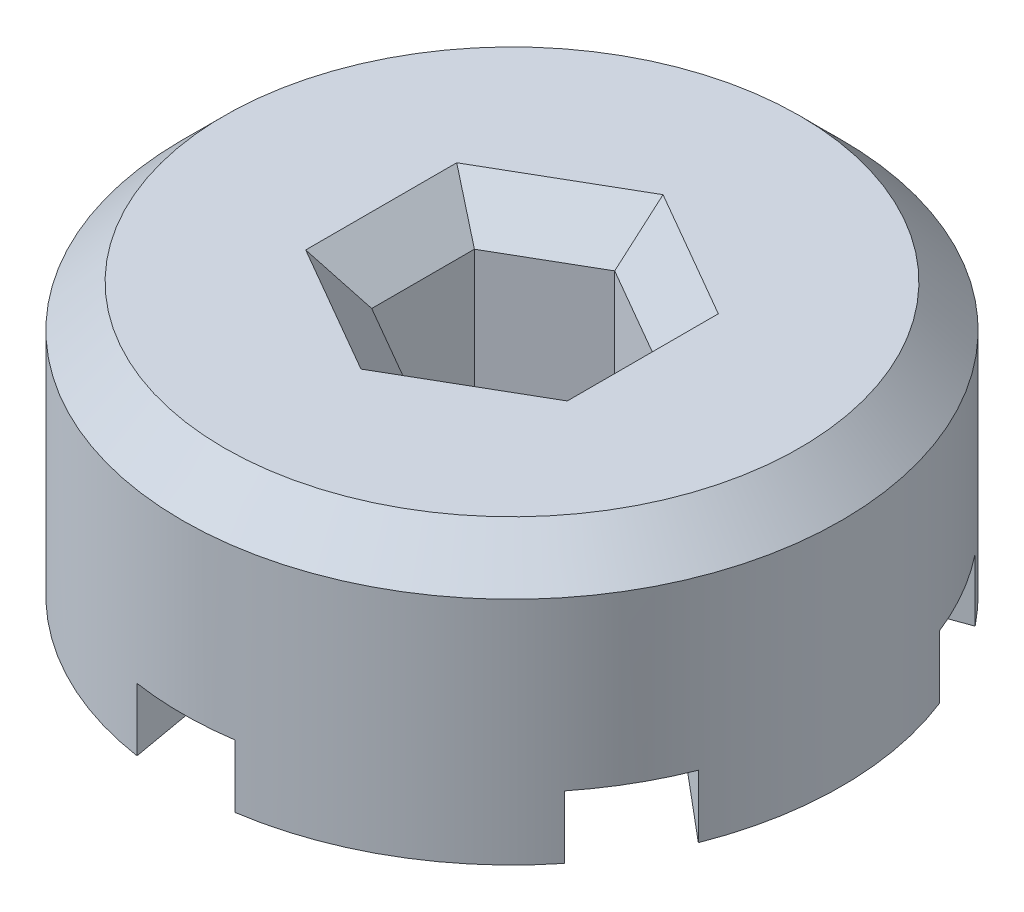
ISO-10303-21;
HEADER;
FILE_DESCRIPTION(('STEP AP214'),'2;1');
FILE_NAME('part.step','',(''),(''),'','','');
FILE_SCHEMA(('AUTOMOTIVE_DESIGN { 1 0 10303 214 1 1 1 1 }'));
ENDSEC;
DATA;
#1=APPLICATION_CONTEXT('core data for automotive mechanical design processes');
#2=APPLICATION_PROTOCOL_DEFINITION('international standard','automotive_design',2000,#1);
#3=PRODUCT_CONTEXT('',#1,'mechanical');
#4=PRODUCT('Part','Part','',(#3));
#5=PRODUCT_RELATED_PRODUCT_CATEGORY('part','',(#4));
#6=PRODUCT_DEFINITION_FORMATION('','',#4);
#7=PRODUCT_DEFINITION_CONTEXT('part definition',#1,'design');
#8=PRODUCT_DEFINITION('design','',#6,#7);
#9=PRODUCT_DEFINITION_SHAPE('','',#8);
#10=(LENGTH_UNIT() NAMED_UNIT(*) SI_UNIT(.MILLI.,.METRE.));
#11=(NAMED_UNIT(*) PLANE_ANGLE_UNIT() SI_UNIT($,.RADIAN.));
#12=(NAMED_UNIT(*) SI_UNIT($,.STERADIAN.) SOLID_ANGLE_UNIT());
#13=UNCERTAINTY_MEASURE_WITH_UNIT(LENGTH_MEASURE(1.E-05),#10,'distance_accuracy_value','');
#14=(GEOMETRIC_REPRESENTATION_CONTEXT(3) GLOBAL_UNCERTAINTY_ASSIGNED_CONTEXT((#13)) GLOBAL_UNIT_ASSIGNED_CONTEXT((#10,
#11,#12)) REPRESENTATION_CONTEXT('',''));
#15=CARTESIAN_POINT('',(0.,0.,0.));
#16=DIRECTION('',(0.,0.,1.));
#17=DIRECTION('',(1.,0.,0.));
#18=AXIS2_PLACEMENT_3D('',#15,#16,#17);
#19=CARTESIAN_POINT('',(0.,10.,0.));
#20=DIRECTION('',(0.,-1.,0.));
#21=DIRECTION('',(0.,0.,-1.));
#22=AXIS2_PLACEMENT_3D('',#19,#20,#21);
#23=CYLINDRICAL_SURFACE('',#22,15.75);
#24=CARTESIAN_POINT('',(0.,7.99999999999999,0.));
#25=DIRECTION('',(0.,1.,0.));
#26=DIRECTION('',(0.,0.,1.));
#27=AXIS2_PLACEMENT_3D('',#24,#25,#26);
#28=CIRCLE('',#27,15.75);
#29=CARTESIAN_POINT('',(0.,7.99999999999999,15.75));
#30=VERTEX_POINT('',#29);
#31=EDGE_CURVE('E400',#30,#30,#28,.F.);
#32=ORIENTED_EDGE('',*,*,#31,.T.);
#33=EDGE_LOOP('',(#32));
#34=FACE_BOUND('',#33,.T.);
#35=CARTESIAN_POINT('',(0.,0.,0.));
#36=DIRECTION('',(0.,1.,0.));
#37=DIRECTION('',(0.,0.,1.));
#38=AXIS2_PLACEMENT_3D('',#35,#36,#37);
#39=CIRCLE('',#38,15.75);
#40=CARTESIAN_POINT('',(-14.6603281465322,0.,5.75649881751027));
#41=VERTEX_POINT('',#40);
#42=CARTESIAN_POINT('',(-12.3154382860851,0.,9.81796719395774));
#43=VERTEX_POINT('',#42);
#44=EDGE_CURVE('E380',#41,#43,#39,.T.);
#45=ORIENTED_EDGE('',*,*,#44,.T.);
#46=DIRECTION('',(0.,1.,0.));
#47=VECTOR('',#46,1.);
#48=CARTESIAN_POINT('',(-12.3154382860851,-3.,9.81796719395774));
#49=LINE('',#48,#47);
#50=CARTESIAN_POINT('',(-12.3154382860851,-3.,9.81796719395774));
#51=VERTEX_POINT('',#50);
#52=EDGE_CURVE('E241',#51,#43,#49,.T.);
#53=ORIENTED_EDGE('',*,*,#52,.F.);
#54=CARTESIAN_POINT('',(0.,-3.,0.));
#55=DIRECTION('',(0.,-1.,0.));
#56=DIRECTION('',(0.,0.,-1.));
#57=AXIS2_PLACEMENT_3D('',#54,#55,#56);
#58=CIRCLE('',#57,15.75);
#59=CARTESIAN_POINT('',(-2.34488986044711,-3.,15.574466011468));
#60=VERTEX_POINT('',#59);
#61=EDGE_CURVE('E232',#60,#51,#58,.T.);
#62=ORIENTED_EDGE('',*,*,#61,.F.);
#63=DIRECTION('',(0.,1.,0.));
#64=VECTOR('',#63,1.);
#65=CARTESIAN_POINT('',(-2.34488986044711,-3.,15.574466011468));
#66=LINE('',#65,#64);
#67=CARTESIAN_POINT('',(-2.34488986044711,0.,15.574466011468));
#68=VERTEX_POINT('',#67);
#69=EDGE_CURVE('E225',#60,#68,#66,.T.);
#70=ORIENTED_EDGE('',*,*,#69,.T.);
#71=CARTESIAN_POINT('',(2.3448898604471,0.,15.574466011468));
#72=VERTEX_POINT('',#71);
#73=EDGE_CURVE('E384',#68,#72,#39,.T.);
#74=ORIENTED_EDGE('',*,*,#73,.T.);
#75=DIRECTION('',(0.,1.,0.));
#76=VECTOR('',#75,1.);
#77=CARTESIAN_POINT('',(2.3448898604471,-3.,15.574466011468));
#78=LINE('',#77,#76);
#79=CARTESIAN_POINT('',(2.3448898604471,-3.,15.574466011468));
#80=VERTEX_POINT('',#79);
#81=EDGE_CURVE('E253',#80,#72,#78,.T.);
#82=ORIENTED_EDGE('',*,*,#81,.F.);
#83=CARTESIAN_POINT('',(0.,-3.,0.));
#84=DIRECTION('',(0.,-1.,0.));
#85=DIRECTION('',(0.,0.,-1.));
#86=AXIS2_PLACEMENT_3D('',#83,#84,#85);
#87=CIRCLE('',#86,15.75);
#88=CARTESIAN_POINT('',(12.315438286085,-3.,9.81796719395775));
#89=VERTEX_POINT('',#88);
#90=EDGE_CURVE('E251',#89,#80,#87,.T.);
#91=ORIENTED_EDGE('',*,*,#90,.F.);
#92=DIRECTION('',(0.,1.,0.));
#93=VECTOR('',#92,1.);
#94=CARTESIAN_POINT('',(12.315438286085,-3.,9.81796719395775));
#95=LINE('',#94,#93);
#96=CARTESIAN_POINT('',(12.315438286085,0.,9.81796719395775));
#97=VERTEX_POINT('',#96);
#98=EDGE_CURVE('E260',#89,#97,#95,.T.);
#99=ORIENTED_EDGE('',*,*,#98,.T.);
#100=CARTESIAN_POINT('',(14.6603281465322,0.,5.75649881751027));
#101=VERTEX_POINT('',#100);
#102=EDGE_CURVE('E830',#97,#101,#39,.T.);
#103=ORIENTED_EDGE('',*,*,#102,.T.);
#104=DIRECTION('',(0.,1.,0.));
#105=VECTOR('',#104,1.);
#106=CARTESIAN_POINT('',(14.6603281465322,-3.,5.75649881751027));
#107=LINE('',#106,#105);
#108=CARTESIAN_POINT('',(14.6603281465322,-3.,5.75649881751027));
#109=VERTEX_POINT('',#108);
#110=EDGE_CURVE('E273',#109,#101,#107,.T.);
#111=ORIENTED_EDGE('',*,*,#110,.F.);
#112=CARTESIAN_POINT('',(0.,-3.,0.));
#113=DIRECTION('',(0.,-1.,0.));
#114=DIRECTION('',(0.,0.,-1.));
#115=AXIS2_PLACEMENT_3D('',#112,#113,#114);
#116=CIRCLE('',#115,15.75);
#117=CARTESIAN_POINT('',(14.6603281465322,-3.,-5.75649881751026));
#118=VERTEX_POINT('',#117);
#119=EDGE_CURVE('E271',#118,#109,#116,.T.);
#120=ORIENTED_EDGE('',*,*,#119,.F.);
#121=DIRECTION('',(0.,1.,0.));
#122=VECTOR('',#121,1.);
#123=CARTESIAN_POINT('',(14.6603281465322,-3.,-5.75649881751026));
#124=LINE('',#123,#122);
#125=CARTESIAN_POINT('',(14.6603281465322,0.,-5.75649881751026));
#126=VERTEX_POINT('',#125);
#127=EDGE_CURVE('E280',#118,#126,#124,.T.);
#128=ORIENTED_EDGE('',*,*,#127,.T.);
#129=CARTESIAN_POINT('',(12.3154382860851,0.,-9.81796719395774));
#130=VERTEX_POINT('',#129);
#131=EDGE_CURVE('E827',#126,#130,#39,.T.);
#132=ORIENTED_EDGE('',*,*,#131,.T.);
#133=DIRECTION('',(0.,1.,0.));
#134=VECTOR('',#133,1.);
#135=CARTESIAN_POINT('',(12.3154382860851,-3.,-9.81796719395774));
#136=LINE('',#135,#134);
#137=CARTESIAN_POINT('',(12.3154382860851,-3.,-9.81796719395774));
#138=VERTEX_POINT('',#137);
#139=EDGE_CURVE('E293',#138,#130,#136,.T.);
#140=ORIENTED_EDGE('',*,*,#139,.F.);
#141=CARTESIAN_POINT('',(0.,-3.,0.));
#142=DIRECTION('',(0.,-1.,0.));
#143=DIRECTION('',(0.,0.,-1.));
#144=AXIS2_PLACEMENT_3D('',#141,#142,#143);
#145=CIRCLE('',#144,15.75);
#146=CARTESIAN_POINT('',(2.34488986044712,-3.,-15.574466011468));
#147=VERTEX_POINT('',#146);
#148=EDGE_CURVE('E291',#147,#138,#145,.T.);
#149=ORIENTED_EDGE('',*,*,#148,.F.);
#150=DIRECTION('',(0.,1.,0.));
#151=VECTOR('',#150,1.);
#152=CARTESIAN_POINT('',(2.34488986044712,-3.,-15.574466011468));
#153=LINE('',#152,#151);
#154=CARTESIAN_POINT('',(2.34488986044712,0.,-15.574466011468));
#155=VERTEX_POINT('',#154);
#156=EDGE_CURVE('E300',#147,#155,#153,.T.);
#157=ORIENTED_EDGE('',*,*,#156,.T.);
#158=CARTESIAN_POINT('',(-2.34488986044709,0.,-15.574466011468));
#159=VERTEX_POINT('',#158);
#160=EDGE_CURVE('E826',#155,#159,#39,.T.);
#161=ORIENTED_EDGE('',*,*,#160,.T.);
#162=DIRECTION('',(0.,1.,0.));
#163=VECTOR('',#162,1.);
#164=CARTESIAN_POINT('',(-2.34488986044709,-3.,-15.574466011468));
#165=LINE('',#164,#163);
#166=CARTESIAN_POINT('',(-2.34488986044709,-3.,-15.574466011468));
#167=VERTEX_POINT('',#166);
#168=EDGE_CURVE('E313',#167,#159,#165,.T.);
#169=ORIENTED_EDGE('',*,*,#168,.F.);
#170=CARTESIAN_POINT('',(0.,-3.,0.));
#171=DIRECTION('',(0.,-1.,0.));
#172=DIRECTION('',(0.,0.,-1.));
#173=AXIS2_PLACEMENT_3D('',#170,#171,#172);
#174=CIRCLE('',#173,15.75);
#175=CARTESIAN_POINT('',(-12.315438286085,-3.,-9.81796719395776));
#176=VERTEX_POINT('',#175);
#177=EDGE_CURVE('E311',#176,#167,#174,.T.);
#178=ORIENTED_EDGE('',*,*,#177,.F.);
#179=DIRECTION('',(0.,1.,0.));
#180=VECTOR('',#179,1.);
#181=CARTESIAN_POINT('',(-12.315438286085,-3.,-9.81796719395776));
#182=LINE('',#181,#180);
#183=CARTESIAN_POINT('',(-12.315438286085,0.,-9.81796719395776));
#184=VERTEX_POINT('',#183);
#185=EDGE_CURVE('E320',#176,#184,#182,.T.);
#186=ORIENTED_EDGE('',*,*,#185,.T.);
#187=CARTESIAN_POINT('',(-14.6603281465322,0.,-5.75649881751027));
#188=VERTEX_POINT('',#187);
#189=EDGE_CURVE('E367',#184,#188,#39,.T.);
#190=ORIENTED_EDGE('',*,*,#189,.T.);
#191=DIRECTION('',(0.,1.,0.));
#192=VECTOR('',#191,1.);
#193=CARTESIAN_POINT('',(-14.6603281465322,-3.,-5.75649881751027));
#194=LINE('',#193,#192);
#195=CARTESIAN_POINT('',(-14.6603281465322,-3.,-5.75649881751027));
#196=VERTEX_POINT('',#195);
#197=EDGE_CURVE('E333',#196,#188,#194,.T.);
#198=ORIENTED_EDGE('',*,*,#197,.F.);
#199=CARTESIAN_POINT('',(0.,-3.,0.));
#200=DIRECTION('',(0.,-1.,0.));
#201=DIRECTION('',(0.,0.,-1.));
#202=AXIS2_PLACEMENT_3D('',#199,#200,#201);
#203=CIRCLE('',#202,15.75);
#204=CARTESIAN_POINT('',(-14.6603281465322,-3.,5.75649881751027));
#205=VERTEX_POINT('',#204);
#206=EDGE_CURVE('E331',#205,#196,#203,.T.);
#207=ORIENTED_EDGE('',*,*,#206,.F.);
#208=DIRECTION('',(0.,1.,0.));
#209=VECTOR('',#208,1.);
#210=CARTESIAN_POINT('',(-14.6603281465322,-3.,5.75649881751027));
#211=LINE('',#210,#209);
#212=EDGE_CURVE('E340',#205,#41,#211,.T.);
#213=ORIENTED_EDGE('',*,*,#212,.T.);
#214=EDGE_LOOP('',(#45,#53,#62,#70,#74,#82,#91,#99,#103,#111,#120,#128,#132,#140,#149,#157,#161,
#169,#178,#186,#190,#198,#207,#213));
#215=FACE_BOUND('',#214,.T.);
#216=ADVANCED_FACE('F34',(#34,#215),#23,.T.);
#217=CARTESIAN_POINT('',(0.,10.,0.));
#218=DIRECTION('',(0.,1.,0.));
#219=DIRECTION('',(0.,0.,1.));
#220=AXIS2_PLACEMENT_3D('',#217,#218,#219);
#221=PLANE('',#220);
#222=CARTESIAN_POINT('',(0.,10.,0.));
#223=DIRECTION('',(0.,1.,0.));
#224=DIRECTION('',(0.,0.,1.));
#225=AXIS2_PLACEMENT_3D('',#222,#223,#224);
#226=CIRCLE('',#225,13.75);
#227=CARTESIAN_POINT('',(0.,10.,13.75));
#228=VERTEX_POINT('',#227);
#229=EDGE_CURVE('E397',#228,#228,#226,.T.);
#230=ORIENTED_EDGE('',*,*,#229,.T.);
#231=EDGE_LOOP('',(#230));
#232=FACE_BOUND('',#231,.T.);
#233=DIRECTION('',(0.866025403784439,0.,-0.5));
#234=VECTOR('',#233,1.);
#235=CARTESIAN_POINT('',(-1.,10.,-6.6395280956807));
#236=LINE('',#235,#234);
#237=CARTESIAN_POINT('',(-6.25,10.,-3.60843918243516));
#238=VERTEX_POINT('',#237);
#239=CARTESIAN_POINT('',(0.,10.,-7.21687836487032));
#240=VERTEX_POINT('',#239);
#241=EDGE_CURVE('E392',#238,#240,#236,.T.);
#242=ORIENTED_EDGE('',*,*,#241,.T.);
#243=DIRECTION('',(0.866025403784439,0.,0.5));
#244=VECTOR('',#243,1.);
#245=CARTESIAN_POINT('',(5.25,10.,-4.18578945162479));
#246=LINE('',#245,#244);
#247=CARTESIAN_POINT('',(6.25,10.,-3.60843918243516));
#248=VERTEX_POINT('',#247);
#249=EDGE_CURVE('E394',#240,#248,#246,.T.);
#250=ORIENTED_EDGE('',*,*,#249,.T.);
#251=DIRECTION('',(0.,0.,1.));
#252=VECTOR('',#251,1.);
#253=CARTESIAN_POINT('',(6.25,10.,2.45373864405591));
#254=LINE('',#253,#252);
#255=CARTESIAN_POINT('',(6.25,10.,3.60843918243516));
#256=VERTEX_POINT('',#255);
#257=EDGE_CURVE('E383',#248,#256,#254,.T.);
#258=ORIENTED_EDGE('',*,*,#257,.T.);
#259=DIRECTION('',(-0.866025403784439,0.,0.5));
#260=VECTOR('',#259,1.);
#261=CARTESIAN_POINT('',(1.,10.,6.6395280956807));
#262=LINE('',#261,#260);
#263=CARTESIAN_POINT('',(0.,10.,7.21687836487033));
#264=VERTEX_POINT('',#263);
#265=EDGE_CURVE('E386',#256,#264,#262,.T.);
#266=ORIENTED_EDGE('',*,*,#265,.T.);
#267=DIRECTION('',(-0.866025403784439,0.,-0.5));
#268=VECTOR('',#267,1.);
#269=CARTESIAN_POINT('',(-5.25,10.,4.18578945162479));
#270=LINE('',#269,#268);
#271=CARTESIAN_POINT('',(-6.25,10.,3.60843918243516));
#272=VERTEX_POINT('',#271);
#273=EDGE_CURVE('E388',#264,#272,#270,.T.);
#274=ORIENTED_EDGE('',*,*,#273,.T.);
#275=DIRECTION('',(0.,0.,-1.));
#276=VECTOR('',#275,1.);
#277=CARTESIAN_POINT('',(-6.25,10.,-2.45373864405591));
#278=LINE('',#277,#276);
#279=EDGE_CURVE('E390',#272,#238,#278,.T.);
#280=ORIENTED_EDGE('',*,*,#279,.T.);
#281=EDGE_LOOP('',(#242,#250,#258,#266,#274,#280));
#282=FACE_BOUND('',#281,.T.);
#283=ADVANCED_FACE('F436',(#232,#282),#221,.T.);
#284=CARTESIAN_POINT('',(0.,0.,0.));
#285=DIRECTION('',(0.,1.,0.));
#286=DIRECTION('',(0.,0.,1.));
#287=AXIS2_PLACEMENT_3D('',#284,#285,#286);
#288=PLANE('',#287);
#289=DIRECTION('',(0.866025403784439,0.,-0.5));
#290=VECTOR('',#289,1.);
#291=CARTESIAN_POINT('',(0.,0.,4.90747728811182));
#292=LINE('',#291,#290);
#293=CARTESIAN_POINT('',(0.,0.,4.90747728811182));
#294=VERTEX_POINT('',#293);
#295=CARTESIAN_POINT('',(4.25,0.,2.45373864405591));
#296=VERTEX_POINT('',#295);
#297=EDGE_CURVE('E361',#294,#296,#292,.T.);
#298=ORIENTED_EDGE('',*,*,#297,.T.);
#299=DIRECTION('',(0.,0.,-1.));
#300=VECTOR('',#299,1.);
#301=CARTESIAN_POINT('',(4.25,0.,2.45373864405591));
#302=LINE('',#301,#300);
#303=CARTESIAN_POINT('',(4.25,0.,-2.45373864405591));
#304=VERTEX_POINT('',#303);
#305=EDGE_CURVE('E346',#296,#304,#302,.T.);
#306=ORIENTED_EDGE('',*,*,#305,.T.);
#307=DIRECTION('',(-0.866025403784439,0.,-0.5));
#308=VECTOR('',#307,1.);
#309=CARTESIAN_POINT('',(4.25,0.,-2.45373864405591));
#310=LINE('',#309,#308);
#311=CARTESIAN_POINT('',(0.,0.,-4.90747728811182));
#312=VERTEX_POINT('',#311);
#313=EDGE_CURVE('E349',#304,#312,#310,.T.);
#314=ORIENTED_EDGE('',*,*,#313,.T.);
#315=DIRECTION('',(-0.866025403784439,0.,0.5));
#316=VECTOR('',#315,1.);
#317=CARTESIAN_POINT('',(0.,0.,-4.90747728811182));
#318=LINE('',#317,#316);
#319=CARTESIAN_POINT('',(-4.25,0.,-2.45373864405591));
#320=VERTEX_POINT('',#319);
#321=EDGE_CURVE('E352',#312,#320,#318,.T.);
#322=ORIENTED_EDGE('',*,*,#321,.T.);
#323=DIRECTION('',(0.,0.,1.));
#324=VECTOR('',#323,1.);
#325=CARTESIAN_POINT('',(-4.25,0.,-2.45373864405591));
#326=LINE('',#325,#324);
#327=CARTESIAN_POINT('',(-4.25,0.,2.45373864405591));
#328=VERTEX_POINT('',#327);
#329=EDGE_CURVE('E355',#320,#328,#326,.T.);
#330=ORIENTED_EDGE('',*,*,#329,.T.);
#331=DIRECTION('',(0.866025403784439,0.,0.5));
#332=VECTOR('',#331,1.);
#333=CARTESIAN_POINT('',(-4.25,0.,2.45373864405591));
#334=LINE('',#333,#332);
#335=EDGE_CURVE('E358',#328,#294,#334,.T.);
#336=ORIENTED_EDGE('',*,*,#335,.T.);
#337=EDGE_LOOP('',(#298,#306,#314,#322,#330,#336));
#338=FACE_BOUND('',#337,.T.);
#339=DIRECTION('',(0.173648177666932,0.,0.984807753012208));
#340=VECTOR('',#339,1.);
#341=CARTESIAN_POINT('',(-4.93757332816402,0.,0.870627396981817));
#342=LINE('',#341,#340);
#343=CARTESIAN_POINT('',(-3.9,0.,6.75499814951862));
#344=VERTEX_POINT('',#343);
#345=EDGE_CURVE('E236',#344,#68,#342,.T.);
#346=ORIENTED_EDGE('',*,*,#345,.F.);
#347=DIRECTION('',(-0.939692620785909,0.,0.342020143325666));
#348=VECTOR('',#347,1.);
#349=CARTESIAN_POINT('',(1.71480122106504,0.,4.71137763372944));
#350=LINE('',#349,#348);
#351=EDGE_CURVE('E220',#344,#43,#350,.T.);
#352=ORIENTED_EDGE('',*,*,#351,.T.);
#353=ORIENTED_EDGE('',*,*,#44,.F.);
#354=DIRECTION('',(-0.766044443118977,0.,0.642787609686541));
#355=VECTOR('',#354,1.);
#356=CARTESIAN_POINT('',(-3.22277210709898,0.,-3.84075023674761));
#357=LINE('',#356,#355);
#358=CARTESIAN_POINT('',(-7.8,0.,0.));
#359=VERTEX_POINT('',#358);
#360=EDGE_CURVE('E329',#359,#41,#357,.T.);
#361=ORIENTED_EDGE('',*,*,#360,.F.);
#362=DIRECTION('',(-0.766044443118977,0.,-0.642787609686541));
#363=VECTOR('',#362,1.);
#364=CARTESIAN_POINT('',(-3.22277210709899,0.,3.84075023674761));
#365=LINE('',#364,#363);
#366=EDGE_CURVE('E324',#359,#188,#365,.T.);
#367=ORIENTED_EDGE('',*,*,#366,.T.);
#368=ORIENTED_EDGE('',*,*,#189,.F.);
#369=DIRECTION('',(-0.939692620785909,0.,-0.342020143325668));
#370=VECTOR('',#369,1.);
#371=CARTESIAN_POINT('',(1.71480122106504,0.,-4.71137763372943));
#372=LINE('',#371,#370);
#373=CARTESIAN_POINT('',(-3.89999999999999,0.,-6.75499814951862));
#374=VERTEX_POINT('',#373);
#375=EDGE_CURVE('E309',#374,#184,#372,.T.);
#376=ORIENTED_EDGE('',*,*,#375,.F.);
#377=DIRECTION('',(0.173648177666933,0.,-0.984807753012208));
#378=VECTOR('',#377,1.);
#379=CARTESIAN_POINT('',(-4.93757332816402,0.,-0.870627396981825));
#380=LINE('',#379,#378);
#381=EDGE_CURVE('E304',#374,#159,#380,.T.);
#382=ORIENTED_EDGE('',*,*,#381,.T.);
#383=ORIENTED_EDGE('',*,*,#160,.F.);
#384=DIRECTION('',(-0.173648177666931,0.,-0.984807753012208));
#385=VECTOR('',#384,1.);
#386=CARTESIAN_POINT('',(4.93757332816402,0.,-0.870627396981814));
#387=LINE('',#386,#385);
#388=CARTESIAN_POINT('',(3.9,0.,-6.75499814951862));
#389=VERTEX_POINT('',#388);
#390=EDGE_CURVE('E289',#389,#155,#387,.T.);
#391=ORIENTED_EDGE('',*,*,#390,.F.);
#392=DIRECTION('',(0.939692620785909,0.,-0.342020143325666));
#393=VECTOR('',#392,1.);
#394=CARTESIAN_POINT('',(-1.71480122106503,0.,-4.71137763372943));
#395=LINE('',#394,#393);
#396=EDGE_CURVE('E284',#389,#130,#395,.T.);
#397=ORIENTED_EDGE('',*,*,#396,.T.);
#398=ORIENTED_EDGE('',*,*,#131,.F.);
#399=DIRECTION('',(0.766044443118977,0.,-0.642787609686541));
#400=VECTOR('',#399,1.);
#401=CARTESIAN_POINT('',(3.22277210709898,0.,3.84075023674761));
#402=LINE('',#401,#400);
#403=CARTESIAN_POINT('',(7.8,0.,0.));
#404=VERTEX_POINT('',#403);
#405=EDGE_CURVE('E269',#404,#126,#402,.T.);
#406=ORIENTED_EDGE('',*,*,#405,.F.);
#407=DIRECTION('',(0.766044443118977,0.,0.642787609686541));
#408=VECTOR('',#407,1.);
#409=CARTESIAN_POINT('',(3.22277210709899,0.,-3.84075023674761));
#410=LINE('',#409,#408);
#411=EDGE_CURVE('E264',#404,#101,#410,.T.);
#412=ORIENTED_EDGE('',*,*,#411,.T.);
#413=ORIENTED_EDGE('',*,*,#102,.F.);
#414=DIRECTION('',(0.939692620785909,0.,0.342020143325667));
#415=VECTOR('',#414,1.);
#416=CARTESIAN_POINT('',(-1.71480122106504,0.,4.71137763372943));
#417=LINE('',#416,#415);
#418=CARTESIAN_POINT('',(3.9,0.,6.75499814951862));
#419=VERTEX_POINT('',#418);
#420=EDGE_CURVE('E249',#419,#97,#417,.T.);
#421=ORIENTED_EDGE('',*,*,#420,.F.);
#422=DIRECTION('',(-0.173648177666933,0.,0.984807753012208));
#423=VECTOR('',#422,1.);
#424=CARTESIAN_POINT('',(4.93757332816402,0.,0.870627396981821));
#425=LINE('',#424,#423);
#426=EDGE_CURVE('E224',#419,#72,#425,.T.);
#427=ORIENTED_EDGE('',*,*,#426,.T.);
#428=ORIENTED_EDGE('',*,*,#73,.F.);
#429=EDGE_LOOP('',(#346,#352,#353,#361,#367,#368,#376,#382,#383,#391,#397,#398,#406,#412,#413,
#421,#427,#428));
#430=FACE_BOUND('',#429,.T.);
#431=ADVANCED_FACE('F453',(#338,#430),#288,.F.);
#432=CARTESIAN_POINT('',(4.25,0.,2.45373864405591));
#433=DIRECTION('',(1.,0.,0.));
#434=DIRECTION('',(0.,0.,-1.));
#435=AXIS2_PLACEMENT_3D('',#432,#433,#434);
#436=PLANE('',#435);
#437=DIRECTION('',(0.,1.,0.));
#438=VECTOR('',#437,1.);
#439=CARTESIAN_POINT('',(4.25,0.,2.45373864405591));
#440=LINE('',#439,#438);
#441=CARTESIAN_POINT('',(4.25,8.00000000000001,2.45373864405591));
#442=VERTEX_POINT('',#441);
#443=EDGE_CURVE('E365',#296,#442,#440,.T.);
#444=ORIENTED_EDGE('',*,*,#443,.T.);
#445=DIRECTION('',(0.,0.,-1.));
#446=VECTOR('',#445,1.);
#447=CARTESIAN_POINT('',(4.25,8.00000000000001,-2.45373864405591));
#448=LINE('',#447,#446);
#449=CARTESIAN_POINT('',(4.25,8.00000000000001,-2.45373864405591));
#450=VERTEX_POINT('',#449);
#451=EDGE_CURVE('E11',#442,#450,#448,.T.);
#452=ORIENTED_EDGE('',*,*,#451,.T.);
#453=DIRECTION('',(0.,1.,0.));
#454=VECTOR('',#453,1.);
#455=CARTESIAN_POINT('',(4.25,0.,-2.45373864405591));
#456=LINE('',#455,#454);
#457=EDGE_CURVE('E364',#304,#450,#456,.T.);
#458=ORIENTED_EDGE('',*,*,#457,.F.);
#459=ORIENTED_EDGE('',*,*,#305,.F.);
#460=EDGE_LOOP('',(#444,#452,#458,#459));
#461=FACE_BOUND('',#460,.T.);
#462=ADVANCED_FACE('F446',(#461),#436,.F.);
#463=CARTESIAN_POINT('',(0.,0.,4.90747728811182));
#464=DIRECTION('',(0.5,0.,0.866025403784439));
#465=DIRECTION('',(0.866025403784439,0.,-0.5));
#466=AXIS2_PLACEMENT_3D('',#463,#464,#465);
#467=PLANE('',#466);
#468=DIRECTION('',(0.,1.,0.));
#469=VECTOR('',#468,1.);
#470=CARTESIAN_POINT('',(0.,0.,4.90747728811182));
#471=LINE('',#470,#469);
#472=CARTESIAN_POINT('',(0.,8.00000000000001,4.90747728811182));
#473=VERTEX_POINT('',#472);
#474=EDGE_CURVE('E368',#294,#473,#471,.T.);
#475=ORIENTED_EDGE('',*,*,#474,.T.);
#476=DIRECTION('',(0.866025403784439,0.,-0.5));
#477=VECTOR('',#476,1.);
#478=CARTESIAN_POINT('',(4.25,8.00000000000001,2.45373864405591));
#479=LINE('',#478,#477);
#480=EDGE_CURVE('E43',#473,#442,#479,.T.);
#481=ORIENTED_EDGE('',*,*,#480,.T.);
#482=ORIENTED_EDGE('',*,*,#443,.F.);
#483=ORIENTED_EDGE('',*,*,#297,.F.);
#484=EDGE_LOOP('',(#475,#481,#482,#483));
#485=FACE_BOUND('',#484,.T.);
#486=ADVANCED_FACE('F457',(#485),#467,.F.);
#487=CARTESIAN_POINT('',(-4.25,0.,2.45373864405591));
#488=DIRECTION('',(-0.5,0.,0.866025403784439));
#489=DIRECTION('',(0.866025403784439,0.,0.5));
#490=AXIS2_PLACEMENT_3D('',#487,#488,#489);
#491=PLANE('',#490);
#492=DIRECTION('',(0.,1.,0.));
#493=VECTOR('',#492,1.);
#494=CARTESIAN_POINT('',(-4.25,0.,2.45373864405591));
#495=LINE('',#494,#493);
#496=CARTESIAN_POINT('',(-4.25,8.00000000000001,2.45373864405591));
#497=VERTEX_POINT('',#496);
#498=EDGE_CURVE('E370',#328,#497,#495,.T.);
#499=ORIENTED_EDGE('',*,*,#498,.T.);
#500=DIRECTION('',(0.866025403784439,0.,0.5));
#501=VECTOR('',#500,1.);
#502=CARTESIAN_POINT('',(0.,8.00000000000001,4.90747728811182));
#503=LINE('',#502,#501);
#504=EDGE_CURVE('E58',#497,#473,#503,.T.);
#505=ORIENTED_EDGE('',*,*,#504,.T.);
#506=ORIENTED_EDGE('',*,*,#474,.F.);
#507=ORIENTED_EDGE('',*,*,#335,.F.);
#508=EDGE_LOOP('',(#499,#505,#506,#507));
#509=FACE_BOUND('',#508,.T.);
#510=ADVANCED_FACE('F458',(#509),#491,.F.);
#511=CARTESIAN_POINT('',(-4.25,0.,-2.45373864405591));
#512=DIRECTION('',(-1.,0.,0.));
#513=DIRECTION('',(0.,0.,1.));
#514=AXIS2_PLACEMENT_3D('',#511,#512,#513);
#515=PLANE('',#514);
#516=DIRECTION('',(0.,1.,0.));
#517=VECTOR('',#516,1.);
#518=CARTESIAN_POINT('',(-4.25,0.,-2.45373864405591));
#519=LINE('',#518,#517);
#520=CARTESIAN_POINT('',(-4.25,8.00000000000001,-2.45373864405591));
#521=VERTEX_POINT('',#520);
#522=EDGE_CURVE('E372',#320,#521,#519,.T.);
#523=ORIENTED_EDGE('',*,*,#522,.T.);
#524=DIRECTION('',(0.,0.,1.));
#525=VECTOR('',#524,1.);
#526=CARTESIAN_POINT('',(-4.25,8.00000000000001,2.45373864405591));
#527=LINE('',#526,#525);
#528=EDGE_CURVE('E408',#521,#497,#527,.T.);
#529=ORIENTED_EDGE('',*,*,#528,.T.);
#530=ORIENTED_EDGE('',*,*,#498,.F.);
#531=ORIENTED_EDGE('',*,*,#329,.F.);
#532=EDGE_LOOP('',(#523,#529,#530,#531));
#533=FACE_BOUND('',#532,.T.);
#534=ADVANCED_FACE('F461',(#533),#515,.F.);
#535=CARTESIAN_POINT('',(0.,0.,-4.90747728811182));
#536=DIRECTION('',(-0.5,0.,-0.866025403784439));
#537=DIRECTION('',(-0.866025403784439,0.,0.5));
#538=AXIS2_PLACEMENT_3D('',#535,#536,#537);
#539=PLANE('',#538);
#540=DIRECTION('',(0.,1.,0.));
#541=VECTOR('',#540,1.);
#542=CARTESIAN_POINT('',(0.,0.,-4.90747728811182));
#543=LINE('',#542,#541);
#544=CARTESIAN_POINT('',(0.,8.00000000000001,-4.90747728811182));
#545=VERTEX_POINT('',#544);
#546=EDGE_CURVE('E375',#312,#545,#543,.T.);
#547=ORIENTED_EDGE('',*,*,#546,.T.);
#548=DIRECTION('',(-0.866025403784439,0.,0.5));
#549=VECTOR('',#548,1.);
#550=CARTESIAN_POINT('',(-4.25,8.00000000000001,-2.45373864405591));
#551=LINE('',#550,#549);
#552=EDGE_CURVE('E406',#545,#521,#551,.T.);
#553=ORIENTED_EDGE('',*,*,#552,.T.);
#554=ORIENTED_EDGE('',*,*,#522,.F.);
#555=ORIENTED_EDGE('',*,*,#321,.F.);
#556=EDGE_LOOP('',(#547,#553,#554,#555));
#557=FACE_BOUND('',#556,.T.);
#558=ADVANCED_FACE('F571',(#557),#539,.F.);
#559=CARTESIAN_POINT('',(4.25,0.,-2.45373864405591));
#560=DIRECTION('',(0.5,0.,-0.866025403784439));
#561=DIRECTION('',(-0.866025403784439,0.,-0.5));
#562=AXIS2_PLACEMENT_3D('',#559,#560,#561);
#563=PLANE('',#562);
#564=ORIENTED_EDGE('',*,*,#457,.T.);
#565=DIRECTION('',(-0.866025403784439,0.,-0.5));
#566=VECTOR('',#565,1.);
#567=CARTESIAN_POINT('',(0.,8.00000000000001,-4.90747728811182));
#568=LINE('',#567,#566);
#569=EDGE_CURVE('E403',#450,#545,#568,.T.);
#570=ORIENTED_EDGE('',*,*,#569,.T.);
#571=ORIENTED_EDGE('',*,*,#546,.F.);
#572=ORIENTED_EDGE('',*,*,#313,.F.);
#573=EDGE_LOOP('',(#564,#570,#571,#572));
#574=FACE_BOUND('',#573,.T.);
#575=ADVANCED_FACE('F450',(#574),#563,.F.);
#576=CARTESIAN_POINT('',(-3.22277210709899,-3.,3.84075023674761));
#577=DIRECTION('',(0.642787609686541,0.,-0.766044443118977));
#578=DIRECTION('',(-0.766044443118977,0.,-0.642787609686541));
#579=AXIS2_PLACEMENT_3D('',#576,#577,#578);
#580=PLANE('',#579);
#581=ORIENTED_EDGE('',*,*,#366,.F.);
#582=DIRECTION('',(0.,1.,0.));
#583=VECTOR('',#582,1.);
#584=CARTESIAN_POINT('',(-7.8,-3.,0.));
#585=LINE('',#584,#583);
#586=CARTESIAN_POINT('',(-7.8,-3.,0.));
#587=VERTEX_POINT('',#586);
#588=EDGE_CURVE('E343',#587,#359,#585,.T.);
#589=ORIENTED_EDGE('',*,*,#588,.F.);
#590=DIRECTION('',(-0.766044443118977,0.,-0.642787609686541));
#591=VECTOR('',#590,1.);
#592=CARTESIAN_POINT('',(-3.22277210709899,-3.,3.84075023674761));
#593=LINE('',#592,#591);
#594=EDGE_CURVE('E325',#587,#196,#593,.T.);
#595=ORIENTED_EDGE('',*,*,#594,.T.);
#596=ORIENTED_EDGE('',*,*,#197,.T.);
#597=EDGE_LOOP('',(#581,#589,#595,#596));
#598=FACE_BOUND('',#597,.T.);
#599=ADVANCED_FACE('F560',(#598),#580,.T.);
#600=CARTESIAN_POINT('',(-3.22277210709898,-3.,-3.84075023674761));
#601=DIRECTION('',(-0.642787609686541,0.,-0.766044443118977));
#602=DIRECTION('',(-0.766044443118977,0.,0.642787609686541));
#603=AXIS2_PLACEMENT_3D('',#600,#601,#602);
#604=PLANE('',#603);
#605=ORIENTED_EDGE('',*,*,#360,.T.);
#606=ORIENTED_EDGE('',*,*,#212,.F.);
#607=DIRECTION('',(-0.766044443118977,0.,0.642787609686541));
#608=VECTOR('',#607,1.);
#609=CARTESIAN_POINT('',(-3.22277210709898,-3.,-3.84075023674761));
#610=LINE('',#609,#608);
#611=EDGE_CURVE('E328',#587,#205,#610,.T.);
#612=ORIENTED_EDGE('',*,*,#611,.F.);
#613=ORIENTED_EDGE('',*,*,#588,.T.);
#614=EDGE_LOOP('',(#605,#606,#612,#613));
#615=FACE_BOUND('',#614,.T.);
#616=ADVANCED_FACE('F556',(#615),#604,.F.);
#617=CARTESIAN_POINT('',(0.,-3.,0.));
#618=DIRECTION('',(0.,-1.,0.));
#619=DIRECTION('',(0.,0.,-1.));
#620=AXIS2_PLACEMENT_3D('',#617,#618,#619);
#621=PLANE('',#620);
#622=ORIENTED_EDGE('',*,*,#594,.F.);
#623=ORIENTED_EDGE('',*,*,#611,.T.);
#624=ORIENTED_EDGE('',*,*,#206,.T.);
#625=EDGE_LOOP('',(#622,#623,#624));
#626=FACE_BOUND('',#625,.T.);
#627=ADVANCED_FACE('F552',(#626),#621,.T.);
#628=CARTESIAN_POINT('',(-4.93757332816402,-3.,-0.870627396981825));
#629=DIRECTION('',(0.984807753012207,0.,0.173648177666933));
#630=DIRECTION('',(0.173648177666933,0.,-0.984807753012208));
#631=AXIS2_PLACEMENT_3D('',#628,#629,#630);
#632=PLANE('',#631);
#633=ORIENTED_EDGE('',*,*,#381,.F.);
#634=DIRECTION('',(0.,1.,0.));
#635=VECTOR('',#634,1.);
#636=CARTESIAN_POINT('',(-3.89999999999999,-3.,-6.75499814951862));
#637=LINE('',#636,#635);
#638=CARTESIAN_POINT('',(-3.89999999999999,-3.,-6.75499814951862));
#639=VERTEX_POINT('',#638);
#640=EDGE_CURVE('E322',#639,#374,#637,.T.);
#641=ORIENTED_EDGE('',*,*,#640,.F.);
#642=DIRECTION('',(0.173648177666933,0.,-0.984807753012208));
#643=VECTOR('',#642,1.);
#644=CARTESIAN_POINT('',(-4.93757332816402,-3.,-0.870627396981825));
#645=LINE('',#644,#643);
#646=EDGE_CURVE('E305',#639,#167,#645,.T.);
#647=ORIENTED_EDGE('',*,*,#646,.T.);
#648=ORIENTED_EDGE('',*,*,#168,.T.);
#649=EDGE_LOOP('',(#633,#641,#647,#648));
#650=FACE_BOUND('',#649,.T.);
#651=ADVANCED_FACE('F548',(#650),#632,.T.);
#652=CARTESIAN_POINT('',(1.71480122106504,-3.,-4.71137763372943));
#653=DIRECTION('',(0.342020143325668,0.,-0.939692620785909));
#654=DIRECTION('',(-0.939692620785909,0.,-0.342020143325668));
#655=AXIS2_PLACEMENT_3D('',#652,#653,#654);
#656=PLANE('',#655);
#657=ORIENTED_EDGE('',*,*,#375,.T.);
#658=ORIENTED_EDGE('',*,*,#185,.F.);
#659=DIRECTION('',(-0.939692620785909,0.,-0.342020143325668));
#660=VECTOR('',#659,1.);
#661=CARTESIAN_POINT('',(1.71480122106504,-3.,-4.71137763372943));
#662=LINE('',#661,#660);
#663=EDGE_CURVE('E308',#639,#176,#662,.T.);
#664=ORIENTED_EDGE('',*,*,#663,.F.);
#665=ORIENTED_EDGE('',*,*,#640,.T.);
#666=EDGE_LOOP('',(#657,#658,#664,#665));
#667=FACE_BOUND('',#666,.T.);
#668=ADVANCED_FACE('F544',(#667),#656,.F.);
#669=CARTESIAN_POINT('',(0.,-3.,0.));
#670=DIRECTION('',(0.,-1.,0.));
#671=DIRECTION('',(0.,0.,-1.));
#672=AXIS2_PLACEMENT_3D('',#669,#670,#671);
#673=PLANE('',#672);
#674=ORIENTED_EDGE('',*,*,#646,.F.);
#675=ORIENTED_EDGE('',*,*,#663,.T.);
#676=ORIENTED_EDGE('',*,*,#177,.T.);
#677=EDGE_LOOP('',(#674,#675,#676));
#678=FACE_BOUND('',#677,.T.);
#679=ADVANCED_FACE('F540',(#678),#673,.T.);
#680=CARTESIAN_POINT('',(-1.71480122106503,-3.,-4.71137763372943));
#681=DIRECTION('',(0.342020143325666,0.,0.939692620785909));
#682=DIRECTION('',(0.939692620785909,0.,-0.342020143325666));
#683=AXIS2_PLACEMENT_3D('',#680,#681,#682);
#684=PLANE('',#683);
#685=ORIENTED_EDGE('',*,*,#396,.F.);
#686=DIRECTION('',(0.,1.,0.));
#687=VECTOR('',#686,1.);
#688=CARTESIAN_POINT('',(3.9,-3.,-6.75499814951862));
#689=LINE('',#688,#687);
#690=CARTESIAN_POINT('',(3.9,-3.,-6.75499814951862));
#691=VERTEX_POINT('',#690);
#692=EDGE_CURVE('E302',#691,#389,#689,.T.);
#693=ORIENTED_EDGE('',*,*,#692,.F.);
#694=DIRECTION('',(0.939692620785909,0.,-0.342020143325666));
#695=VECTOR('',#694,1.);
#696=CARTESIAN_POINT('',(-1.71480122106503,-3.,-4.71137763372943));
#697=LINE('',#696,#695);
#698=EDGE_CURVE('E285',#691,#138,#697,.T.);
#699=ORIENTED_EDGE('',*,*,#698,.T.);
#700=ORIENTED_EDGE('',*,*,#139,.T.);
#701=EDGE_LOOP('',(#685,#693,#699,#700));
#702=FACE_BOUND('',#701,.T.);
#703=ADVANCED_FACE('F536',(#702),#684,.T.);
#704=CARTESIAN_POINT('',(4.93757332816402,-3.,-0.870627396981814));
#705=DIRECTION('',(0.984807753012208,0.,-0.173648177666931));
#706=DIRECTION('',(-0.173648177666931,0.,-0.984807753012208));
#707=AXIS2_PLACEMENT_3D('',#704,#705,#706);
#708=PLANE('',#707);
#709=ORIENTED_EDGE('',*,*,#390,.T.);
#710=ORIENTED_EDGE('',*,*,#156,.F.);
#711=DIRECTION('',(-0.173648177666931,0.,-0.984807753012208));
#712=VECTOR('',#711,1.);
#713=CARTESIAN_POINT('',(4.93757332816402,-3.,-0.870627396981814));
#714=LINE('',#713,#712);
#715=EDGE_CURVE('E288',#691,#147,#714,.T.);
#716=ORIENTED_EDGE('',*,*,#715,.F.);
#717=ORIENTED_EDGE('',*,*,#692,.T.);
#718=EDGE_LOOP('',(#709,#710,#716,#717));
#719=FACE_BOUND('',#718,.T.);
#720=ADVANCED_FACE('F532',(#719),#708,.F.);
#721=CARTESIAN_POINT('',(0.,-3.,0.));
#722=DIRECTION('',(0.,-1.,0.));
#723=DIRECTION('',(0.,0.,-1.));
#724=AXIS2_PLACEMENT_3D('',#721,#722,#723);
#725=PLANE('',#724);
#726=ORIENTED_EDGE('',*,*,#698,.F.);
#727=ORIENTED_EDGE('',*,*,#715,.T.);
#728=ORIENTED_EDGE('',*,*,#148,.T.);
#729=EDGE_LOOP('',(#726,#727,#728));
#730=FACE_BOUND('',#729,.T.);
#731=ADVANCED_FACE('F528',(#730),#725,.T.);
#732=CARTESIAN_POINT('',(3.22277210709899,-3.,-3.84075023674761));
#733=DIRECTION('',(-0.642787609686541,0.,0.766044443118977));
#734=DIRECTION('',(0.766044443118977,0.,0.642787609686541));
#735=AXIS2_PLACEMENT_3D('',#732,#733,#734);
#736=PLANE('',#735);
#737=ORIENTED_EDGE('',*,*,#411,.F.);
#738=DIRECTION('',(0.,1.,0.));
#739=VECTOR('',#738,1.);
#740=CARTESIAN_POINT('',(7.8,-3.,0.));
#741=LINE('',#740,#739);
#742=CARTESIAN_POINT('',(7.8,-3.,0.));
#743=VERTEX_POINT('',#742);
#744=EDGE_CURVE('E282',#743,#404,#741,.T.);
#745=ORIENTED_EDGE('',*,*,#744,.F.);
#746=DIRECTION('',(0.766044443118977,0.,0.642787609686541));
#747=VECTOR('',#746,1.);
#748=CARTESIAN_POINT('',(3.22277210709899,-3.,-3.84075023674761));
#749=LINE('',#748,#747);
#750=EDGE_CURVE('E265',#743,#109,#749,.T.);
#751=ORIENTED_EDGE('',*,*,#750,.T.);
#752=ORIENTED_EDGE('',*,*,#110,.T.);
#753=EDGE_LOOP('',(#737,#745,#751,#752));
#754=FACE_BOUND('',#753,.T.);
#755=ADVANCED_FACE('F524',(#754),#736,.T.);
#756=CARTESIAN_POINT('',(3.22277210709898,-3.,3.84075023674761));
#757=DIRECTION('',(0.64278760968654,0.,0.766044443118977));
#758=DIRECTION('',(0.766044443118977,0.,-0.64278760968654));
#759=AXIS2_PLACEMENT_3D('',#756,#757,#758);
#760=PLANE('',#759);
#761=ORIENTED_EDGE('',*,*,#405,.T.);
#762=ORIENTED_EDGE('',*,*,#127,.F.);
#763=DIRECTION('',(0.766044443118977,0.,-0.642787609686541));
#764=VECTOR('',#763,1.);
#765=CARTESIAN_POINT('',(3.22277210709898,-3.,3.84075023674761));
#766=LINE('',#765,#764);
#767=EDGE_CURVE('E268',#743,#118,#766,.T.);
#768=ORIENTED_EDGE('',*,*,#767,.F.);
#769=ORIENTED_EDGE('',*,*,#744,.T.);
#770=EDGE_LOOP('',(#761,#762,#768,#769));
#771=FACE_BOUND('',#770,.T.);
#772=ADVANCED_FACE('F520',(#771),#760,.F.);
#773=CARTESIAN_POINT('',(0.,-3.,0.));
#774=DIRECTION('',(0.,-1.,0.));
#775=DIRECTION('',(0.,0.,-1.));
#776=AXIS2_PLACEMENT_3D('',#773,#774,#775);
#777=PLANE('',#776);
#778=ORIENTED_EDGE('',*,*,#750,.F.);
#779=ORIENTED_EDGE('',*,*,#767,.T.);
#780=ORIENTED_EDGE('',*,*,#119,.T.);
#781=EDGE_LOOP('',(#778,#779,#780));
#782=FACE_BOUND('',#781,.T.);
#783=ADVANCED_FACE('F516',(#782),#777,.T.);
#784=CARTESIAN_POINT('',(4.93757332816402,-3.,0.870627396981821));
#785=DIRECTION('',(-0.984807753012208,0.,-0.173648177666933));
#786=DIRECTION('',(-0.173648177666933,0.,0.984807753012208));
#787=AXIS2_PLACEMENT_3D('',#784,#785,#786);
#788=PLANE('',#787);
#789=ORIENTED_EDGE('',*,*,#426,.F.);
#790=DIRECTION('',(0.,1.,0.));
#791=VECTOR('',#790,1.);
#792=CARTESIAN_POINT('',(3.9,-3.,6.75499814951862));
#793=LINE('',#792,#791);
#794=CARTESIAN_POINT('',(3.9,-3.,6.75499814951862));
#795=VERTEX_POINT('',#794);
#796=EDGE_CURVE('E262',#795,#419,#793,.T.);
#797=ORIENTED_EDGE('',*,*,#796,.F.);
#798=DIRECTION('',(-0.173648177666933,0.,0.984807753012208));
#799=VECTOR('',#798,1.);
#800=CARTESIAN_POINT('',(4.93757332816402,-3.,0.870627396981821));
#801=LINE('',#800,#799);
#802=EDGE_CURVE('E245',#795,#80,#801,.T.);
#803=ORIENTED_EDGE('',*,*,#802,.T.);
#804=ORIENTED_EDGE('',*,*,#81,.T.);
#805=EDGE_LOOP('',(#789,#797,#803,#804));
#806=FACE_BOUND('',#805,.T.);
#807=ADVANCED_FACE('F512',(#806),#788,.T.);
#808=CARTESIAN_POINT('',(-1.71480122106504,-3.,4.71137763372943));
#809=DIRECTION('',(-0.342020143325667,0.,0.939692620785909));
#810=DIRECTION('',(0.939692620785909,0.,0.342020143325667));
#811=AXIS2_PLACEMENT_3D('',#808,#809,#810);
#812=PLANE('',#811);
#813=ORIENTED_EDGE('',*,*,#420,.T.);
#814=ORIENTED_EDGE('',*,*,#98,.F.);
#815=DIRECTION('',(0.939692620785909,0.,0.342020143325667));
#816=VECTOR('',#815,1.);
#817=CARTESIAN_POINT('',(-1.71480122106504,-3.,4.71137763372943));
#818=LINE('',#817,#816);
#819=EDGE_CURVE('E248',#795,#89,#818,.T.);
#820=ORIENTED_EDGE('',*,*,#819,.F.);
#821=ORIENTED_EDGE('',*,*,#796,.T.);
#822=EDGE_LOOP('',(#813,#814,#820,#821));
#823=FACE_BOUND('',#822,.T.);
#824=ADVANCED_FACE('F508',(#823),#812,.F.);
#825=CARTESIAN_POINT('',(0.,-3.,0.));
#826=DIRECTION('',(0.,-1.,0.));
#827=DIRECTION('',(0.,0.,-1.));
#828=AXIS2_PLACEMENT_3D('',#825,#826,#827);
#829=PLANE('',#828);
#830=ORIENTED_EDGE('',*,*,#802,.F.);
#831=ORIENTED_EDGE('',*,*,#819,.T.);
#832=ORIENTED_EDGE('',*,*,#90,.T.);
#833=EDGE_LOOP('',(#830,#831,#832));
#834=FACE_BOUND('',#833,.T.);
#835=ADVANCED_FACE('F505',(#834),#829,.T.);
#836=CARTESIAN_POINT('',(1.71480122106504,-3.,4.71137763372944));
#837=DIRECTION('',(-0.342020143325666,0.,-0.939692620785909));
#838=DIRECTION('',(-0.939692620785909,0.,0.342020143325666));
#839=AXIS2_PLACEMENT_3D('',#836,#837,#838);
#840=PLANE('',#839);
#841=ORIENTED_EDGE('',*,*,#351,.F.);
#842=DIRECTION('',(0.,1.,0.));
#843=VECTOR('',#842,1.);
#844=CARTESIAN_POINT('',(-3.9,-3.,6.75499814951862));
#845=LINE('',#844,#843);
#846=CARTESIAN_POINT('',(-3.9,-3.,6.75499814951862));
#847=VERTEX_POINT('',#846);
#848=EDGE_CURVE('E214',#847,#344,#845,.T.);
#849=ORIENTED_EDGE('',*,*,#848,.F.);
#850=DIRECTION('',(-0.939692620785909,0.,0.342020143325666));
#851=VECTOR('',#850,1.);
#852=CARTESIAN_POINT('',(1.71480122106504,-3.,4.71137763372944));
#853=LINE('',#852,#851);
#854=EDGE_CURVE('E218',#847,#51,#853,.T.);
#855=ORIENTED_EDGE('',*,*,#854,.T.);
#856=ORIENTED_EDGE('',*,*,#52,.T.);
#857=EDGE_LOOP('',(#841,#849,#855,#856));
#858=FACE_BOUND('',#857,.T.);
#859=ADVANCED_FACE('F216',(#858),#840,.T.);
#860=CARTESIAN_POINT('',(-4.93757332816402,-3.,0.870627396981817));
#861=DIRECTION('',(-0.984807753012208,0.,0.173648177666932));
#862=DIRECTION('',(0.173648177666932,0.,0.984807753012208));
#863=AXIS2_PLACEMENT_3D('',#860,#861,#862);
#864=PLANE('',#863);
#865=ORIENTED_EDGE('',*,*,#345,.T.);
#866=ORIENTED_EDGE('',*,*,#69,.F.);
#867=DIRECTION('',(0.173648177666932,0.,0.984807753012208));
#868=VECTOR('',#867,1.);
#869=CARTESIAN_POINT('',(-4.93757332816402,-3.,0.870627396981817));
#870=LINE('',#869,#868);
#871=EDGE_CURVE('E228',#847,#60,#870,.T.);
#872=ORIENTED_EDGE('',*,*,#871,.F.);
#873=ORIENTED_EDGE('',*,*,#848,.T.);
#874=EDGE_LOOP('',(#865,#866,#872,#873));
#875=FACE_BOUND('',#874,.T.);
#876=ADVANCED_FACE('F229',(#875),#864,.F.);
#877=CARTESIAN_POINT('',(0.,-3.,0.));
#878=DIRECTION('',(0.,-1.,0.));
#879=DIRECTION('',(0.,0.,-1.));
#880=AXIS2_PLACEMENT_3D('',#877,#878,#879);
#881=PLANE('',#880);
#882=ORIENTED_EDGE('',*,*,#854,.F.);
#883=ORIENTED_EDGE('',*,*,#871,.T.);
#884=ORIENTED_EDGE('',*,*,#61,.T.);
#885=EDGE_LOOP('',(#882,#883,#884));
#886=FACE_BOUND('',#885,.T.);
#887=ADVANCED_FACE('F234',(#886),#881,.T.);
#888=CARTESIAN_POINT('',(0.,10.,0.));
#889=DIRECTION('',(0.,-1.,0.));
#890=DIRECTION('',(0.,0.,-1.));
#891=AXIS2_PLACEMENT_3D('',#888,#889,#890);
#892=CONICAL_SURFACE('',#891,13.75,0.785398163397449);
#893=ORIENTED_EDGE('',*,*,#31,.F.);
#894=EDGE_LOOP('',(#893));
#895=FACE_BOUND('',#894,.T.);
#896=ORIENTED_EDGE('',*,*,#229,.F.);
#897=EDGE_LOOP('',(#896));
#898=FACE_BOUND('',#897,.T.);
#899=ADVANCED_FACE('F487',(#895,#898),#892,.T.);
#900=CARTESIAN_POINT('',(-4.25,8.00000000000001,2.45373864405591));
#901=DIRECTION('',(0.353553390593273,0.707106781186549,-0.612372435695793));
#902=DIRECTION('',(-0.866025403784439,0.,-0.5));
#903=AXIS2_PLACEMENT_3D('',#900,#901,#902);
#904=PLANE('',#903);
#905=DIRECTION('',(-0.654653670707978,0.654653670707976,0.377964473009228));
#906=VECTOR('',#905,1.);
#907=CARTESIAN_POINT('',(-3.03571428571428,6.78571428571429,1.75267046003993));
#908=LINE('',#907,#906);
#909=EDGE_CURVE('E421',#272,#497,#908,.F.);
#910=ORIENTED_EDGE('',*,*,#909,.F.);
#911=ORIENTED_EDGE('',*,*,#273,.F.);
#912=DIRECTION('',(0.,0.654653670707976,0.755928946018456));
#913=VECTOR('',#912,1.);
#914=CARTESIAN_POINT('',(0.,6.78571428571429,3.50534092007987));
#915=LINE('',#914,#913);
#916=EDGE_CURVE('E38',#473,#264,#915,.T.);
#917=ORIENTED_EDGE('',*,*,#916,.F.);
#918=ORIENTED_EDGE('',*,*,#504,.F.);
#919=EDGE_LOOP('',(#910,#911,#917,#918));
#920=FACE_BOUND('',#919,.T.);
#921=ADVANCED_FACE('F36',(#920),#904,.T.);
#922=CARTESIAN_POINT('',(0.,8.00000000000001,4.90747728811182));
#923=DIRECTION('',(-0.353553390593273,0.707106781186549,-0.612372435695793));
#924=DIRECTION('',(-0.866025403784439,0.,0.5));
#925=AXIS2_PLACEMENT_3D('',#922,#923,#924);
#926=PLANE('',#925);
#927=ORIENTED_EDGE('',*,*,#916,.T.);
#928=ORIENTED_EDGE('',*,*,#265,.F.);
#929=DIRECTION('',(0.654653670707978,0.654653670707976,0.377964473009228));
#930=VECTOR('',#929,1.);
#931=CARTESIAN_POINT('',(3.03571428571429,6.78571428571429,1.75267046003993));
#932=LINE('',#931,#930);
#933=EDGE_CURVE('E419',#442,#256,#932,.T.);
#934=ORIENTED_EDGE('',*,*,#933,.F.);
#935=ORIENTED_EDGE('',*,*,#480,.F.);
#936=EDGE_LOOP('',(#927,#928,#934,#935));
#937=FACE_BOUND('',#936,.T.);
#938=ADVANCED_FACE('F431',(#937),#926,.T.);
#939=CARTESIAN_POINT('',(-4.25,8.00000000000001,-2.45373864405591));
#940=DIRECTION('',(0.707106781186546,0.707106781186549,0.));
#941=DIRECTION('',(0.,0.,-1.));
#942=AXIS2_PLACEMENT_3D('',#939,#940,#941);
#943=PLANE('',#942);
#944=ORIENTED_EDGE('',*,*,#909,.T.);
#945=ORIENTED_EDGE('',*,*,#528,.F.);
#946=DIRECTION('',(-0.654653670707978,0.654653670707976,-0.377964473009228));
#947=VECTOR('',#946,1.);
#948=CARTESIAN_POINT('',(-3.03571428571428,6.78571428571429,-1.75267046003993));
#949=LINE('',#948,#947);
#950=EDGE_CURVE('E416',#238,#521,#949,.F.);
#951=ORIENTED_EDGE('',*,*,#950,.F.);
#952=ORIENTED_EDGE('',*,*,#279,.F.);
#953=EDGE_LOOP('',(#944,#945,#951,#952));
#954=FACE_BOUND('',#953,.T.);
#955=ADVANCED_FACE('F462',(#954),#943,.T.);
#956=CARTESIAN_POINT('',(4.25,8.00000000000001,2.45373864405591));
#957=DIRECTION('',(-0.707106781186546,0.707106781186549,0.));
#958=DIRECTION('',(0.,0.,1.));
#959=AXIS2_PLACEMENT_3D('',#956,#957,#958);
#960=PLANE('',#959);
#961=ORIENTED_EDGE('',*,*,#933,.T.);
#962=ORIENTED_EDGE('',*,*,#257,.F.);
#963=DIRECTION('',(-0.654653670707978,-0.654653670707976,0.377964473009228));
#964=VECTOR('',#963,1.);
#965=CARTESIAN_POINT('',(4.25,8.00000000000001,-2.45373864405591));
#966=LINE('',#965,#964);
#967=EDGE_CURVE('E414',#450,#248,#966,.F.);
#968=ORIENTED_EDGE('',*,*,#967,.F.);
#969=ORIENTED_EDGE('',*,*,#451,.F.);
#970=EDGE_LOOP('',(#961,#962,#968,#969));
#971=FACE_BOUND('',#970,.T.);
#972=ADVANCED_FACE('F442',(#971),#960,.T.);
#973=CARTESIAN_POINT('',(0.,8.00000000000001,-4.90747728811182));
#974=DIRECTION('',(0.353553390593273,0.707106781186549,0.612372435695794));
#975=DIRECTION('',(0.866025403784439,0.,-0.5));
#976=AXIS2_PLACEMENT_3D('',#973,#974,#975);
#977=PLANE('',#976);
#978=ORIENTED_EDGE('',*,*,#950,.T.);
#979=ORIENTED_EDGE('',*,*,#552,.F.);
#980=DIRECTION('',(0.,0.654653670707976,-0.755928946018455));
#981=VECTOR('',#980,1.);
#982=CARTESIAN_POINT('',(0.,6.78571428571429,-3.50534092007987));
#983=LINE('',#982,#981);
#984=EDGE_CURVE('E412',#240,#545,#983,.F.);
#985=ORIENTED_EDGE('',*,*,#984,.F.);
#986=ORIENTED_EDGE('',*,*,#241,.F.);
#987=EDGE_LOOP('',(#978,#979,#985,#986));
#988=FACE_BOUND('',#987,.T.);
#989=ADVANCED_FACE('F466',(#988),#977,.T.);
#990=CARTESIAN_POINT('',(4.25,8.00000000000001,-2.45373864405591));
#991=DIRECTION('',(-0.353553390593273,0.707106781186549,0.612372435695794));
#992=DIRECTION('',(0.866025403784439,0.,0.5));
#993=AXIS2_PLACEMENT_3D('',#990,#991,#992);
#994=PLANE('',#993);
#995=ORIENTED_EDGE('',*,*,#967,.T.);
#996=ORIENTED_EDGE('',*,*,#249,.F.);
#997=ORIENTED_EDGE('',*,*,#984,.T.);
#998=ORIENTED_EDGE('',*,*,#569,.F.);
#999=EDGE_LOOP('',(#995,#996,#997,#998));
#1000=FACE_BOUND('',#999,.T.);
#1001=ADVANCED_FACE('F469',(#1000),#994,.T.);
#1002=CLOSED_SHELL('',(#216,#283,#431,#462,#486,#510,#534,#558,#575,#599,#616,#627,#651,#668,
#679,#703,#720,#731,#755,#772,#783,#807,#824,#835,#859,#876,#887,#899,#921,#938,#955,#972,#989,#1001));
#1003=MANIFOLD_SOLID_BREP('B2',#1002);
#1004=ADVANCED_BREP_SHAPE_REPRESENTATION('',(#18,#1003),#14);
#1005=SHAPE_DEFINITION_REPRESENTATION(#9,#1004);
ENDSEC;
END-ISO-10303-21;
